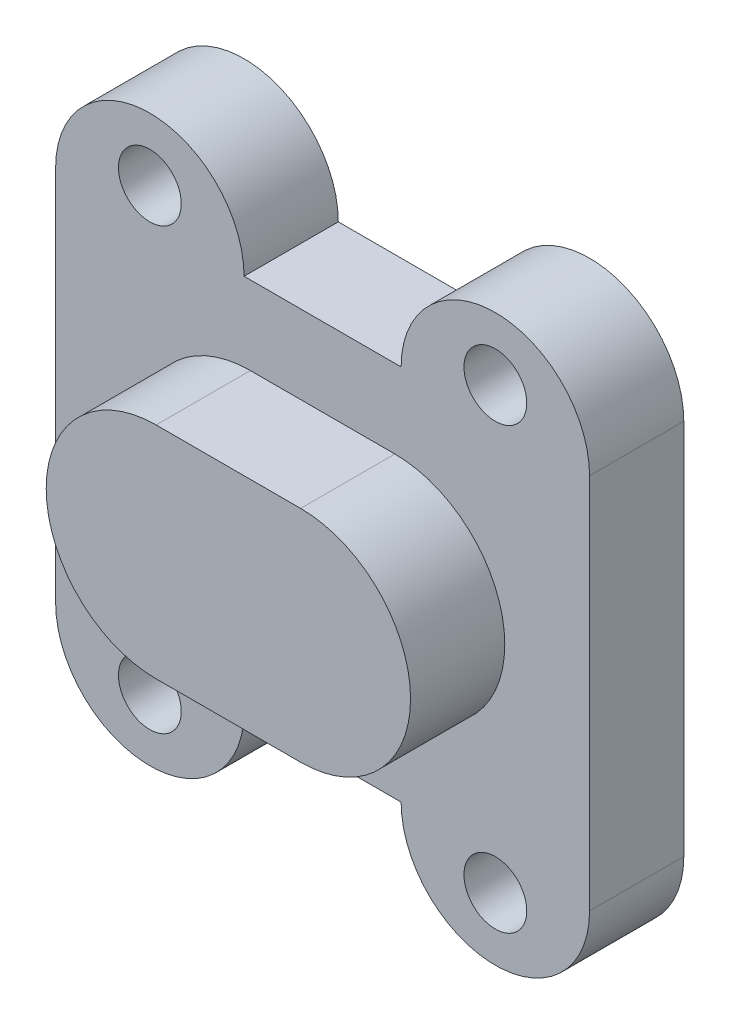
ISO-10303-21;
HEADER;
FILE_DESCRIPTION(('STEP AP214'),'2;1');
FILE_NAME('part.step','',(''),(''),'','','');
FILE_SCHEMA(('AUTOMOTIVE_DESIGN { 1 0 10303 214 1 1 1 1 }'));
ENDSEC;
DATA;
#1=APPLICATION_CONTEXT('core data for automotive mechanical design processes');
#2=APPLICATION_PROTOCOL_DEFINITION('international standard','automotive_design',2000,#1);
#3=PRODUCT_CONTEXT('',#1,'mechanical');
#4=PRODUCT('Part','Part','',(#3));
#5=PRODUCT_RELATED_PRODUCT_CATEGORY('part','',(#4));
#6=PRODUCT_DEFINITION_FORMATION('','',#4);
#7=PRODUCT_DEFINITION_CONTEXT('part definition',#1,'design');
#8=PRODUCT_DEFINITION('design','',#6,#7);
#9=PRODUCT_DEFINITION_SHAPE('','',#8);
#10=(LENGTH_UNIT() NAMED_UNIT(*) SI_UNIT(.MILLI.,.METRE.));
#11=(NAMED_UNIT(*) PLANE_ANGLE_UNIT() SI_UNIT($,.RADIAN.));
#12=(NAMED_UNIT(*) SI_UNIT($,.STERADIAN.) SOLID_ANGLE_UNIT());
#13=UNCERTAINTY_MEASURE_WITH_UNIT(LENGTH_MEASURE(1.E-05),#10,'distance_accuracy_value','');
#14=(GEOMETRIC_REPRESENTATION_CONTEXT(3) GLOBAL_UNCERTAINTY_ASSIGNED_CONTEXT((#13)) GLOBAL_UNIT_ASSIGNED_CONTEXT((#10,
#11,#12)) REPRESENTATION_CONTEXT('',''));
#15=CARTESIAN_POINT('',(0.,0.,0.));
#16=DIRECTION('',(0.,0.,1.));
#17=DIRECTION('',(1.,0.,0.));
#18=AXIS2_PLACEMENT_3D('',#15,#16,#17);
#19=CARTESIAN_POINT('',(11.,-1.,3.));
#20=DIRECTION('',(0.,0.,1.));
#21=DIRECTION('',(1.,0.,0.));
#22=AXIS2_PLACEMENT_3D('',#19,#20,#21);
#23=PLANE('',#22);
#24=CARTESIAN_POINT('',(3.2,-7.,3.));
#25=DIRECTION('',(0.,0.,1.));
#26=DIRECTION('',(1.,0.,0.));
#27=AXIS2_PLACEMENT_3D('',#24,#25,#26);
#28=CIRCLE('',#27,3.5);
#29=CARTESIAN_POINT('',(3.2,-3.5,3.));
#30=VERTEX_POINT('',#29);
#31=CARTESIAN_POINT('',(3.2,-10.5,3.));
#32=VERTEX_POINT('',#31);
#33=EDGE_CURVE('E60',#30,#32,#28,.T.);
#34=ORIENTED_EDGE('',*,*,#33,.F.);
#35=DIRECTION('',(-1.,0.,0.));
#36=VECTOR('',#35,1.);
#37=CARTESIAN_POINT('',(3.2,-3.5,3.));
#38=LINE('',#37,#36);
#39=CARTESIAN_POINT('',(7.8,-3.5,3.));
#40=VERTEX_POINT('',#39);
#41=EDGE_CURVE('E64',#40,#30,#38,.T.);
#42=ORIENTED_EDGE('',*,*,#41,.F.);
#43=CARTESIAN_POINT('',(7.8,-7.,3.));
#44=DIRECTION('',(0.,0.,1.));
#45=DIRECTION('',(1.,0.,0.));
#46=AXIS2_PLACEMENT_3D('',#43,#44,#45);
#47=CIRCLE('',#46,3.5);
#48=CARTESIAN_POINT('',(7.8,-10.5,3.));
#49=VERTEX_POINT('',#48);
#50=EDGE_CURVE('E489',#49,#40,#47,.T.);
#51=ORIENTED_EDGE('',*,*,#50,.F.);
#52=DIRECTION('',(1.,0.,0.));
#53=VECTOR('',#52,1.);
#54=CARTESIAN_POINT('',(3.2,-10.5,3.));
#55=LINE('',#54,#53);
#56=EDGE_CURVE('E499',#32,#49,#55,.T.);
#57=ORIENTED_EDGE('',*,*,#56,.F.);
#58=EDGE_LOOP('',(#34,#42,#51,#57));
#59=FACE_BOUND('',#58,.T.);
#60=CARTESIAN_POINT('',(11.,0.,3.));
#61=DIRECTION('',(0.,0.,1.));
#62=DIRECTION('',(1.,0.,0.));
#63=AXIS2_PLACEMENT_3D('',#60,#61,#62);
#64=CIRCLE('',#63,1.);
#65=CARTESIAN_POINT('',(12.,0.,3.));
#66=VERTEX_POINT('',#65);
#67=EDGE_CURVE('E172',#66,#66,#64,.T.);
#68=ORIENTED_EDGE('',*,*,#67,.F.);
#69=EDGE_LOOP('',(#68));
#70=FACE_BOUND('',#69,.T.);
#71=CARTESIAN_POINT('',(11.,-14.,3.));
#72=DIRECTION('',(0.,0.,1.));
#73=DIRECTION('',(1.,0.,0.));
#74=AXIS2_PLACEMENT_3D('',#71,#72,#73);
#75=CIRCLE('',#74,0.999999999999998);
#76=CARTESIAN_POINT('',(12.,-14.,3.));
#77=VERTEX_POINT('',#76);
#78=EDGE_CURVE('E188',#77,#77,#75,.T.);
#79=ORIENTED_EDGE('',*,*,#78,.F.);
#80=EDGE_LOOP('',(#79));
#81=FACE_BOUND('',#80,.T.);
#82=CARTESIAN_POINT('',(11.,-1.,3.));
#83=DIRECTION('',(0.,0.,1.));
#84=DIRECTION('',(1.,0.,0.));
#85=AXIS2_PLACEMENT_3D('',#82,#83,#84);
#86=CIRCLE('',#85,3.);
#87=CARTESIAN_POINT('',(14.,-1.,3.));
#88=VERTEX_POINT('',#87);
#89=CARTESIAN_POINT('',(8.,-1.,3.));
#90=VERTEX_POINT('',#89);
#91=EDGE_CURVE('E196',#88,#90,#86,.T.);
#92=ORIENTED_EDGE('',*,*,#91,.T.);
#93=DIRECTION('',(-1.,0.,0.));
#94=VECTOR('',#93,1.);
#95=CARTESIAN_POINT('',(3.,-1.,3.));
#96=LINE('',#95,#94);
#97=CARTESIAN_POINT('',(3.,-1.,3.));
#98=VERTEX_POINT('',#97);
#99=EDGE_CURVE('E200',#90,#98,#96,.T.);
#100=ORIENTED_EDGE('',*,*,#99,.T.);
#101=CARTESIAN_POINT('',(0.,-1.,3.));
#102=DIRECTION('',(0.,0.,1.));
#103=DIRECTION('',(1.,0.,0.));
#104=AXIS2_PLACEMENT_3D('',#101,#102,#103);
#105=CIRCLE('',#104,3.);
#106=CARTESIAN_POINT('',(-3.,-1.,3.));
#107=VERTEX_POINT('',#106);
#108=EDGE_CURVE('E204',#98,#107,#105,.T.);
#109=ORIENTED_EDGE('',*,*,#108,.T.);
#110=DIRECTION('',(0.,-1.,0.));
#111=VECTOR('',#110,1.);
#112=CARTESIAN_POINT('',(-3.,-1.,3.));
#113=LINE('',#112,#111);
#114=CARTESIAN_POINT('',(-3.,-13.,3.));
#115=VERTEX_POINT('',#114);
#116=EDGE_CURVE('E207',#107,#115,#113,.T.);
#117=ORIENTED_EDGE('',*,*,#116,.T.);
#118=CARTESIAN_POINT('',(0.,-13.,3.));
#119=DIRECTION('',(0.,0.,1.));
#120=DIRECTION('',(1.,0.,0.));
#121=AXIS2_PLACEMENT_3D('',#118,#119,#120);
#122=CIRCLE('',#121,3.);
#123=CARTESIAN_POINT('',(3.,-13.,3.));
#124=VERTEX_POINT('',#123);
#125=EDGE_CURVE('E210',#115,#124,#122,.T.);
#126=ORIENTED_EDGE('',*,*,#125,.T.);
#127=DIRECTION('',(1.,0.,0.));
#128=VECTOR('',#127,1.);
#129=CARTESIAN_POINT('',(3.,-13.,3.));
#130=LINE('',#129,#128);
#131=CARTESIAN_POINT('',(8.,-13.,3.));
#132=VERTEX_POINT('',#131);
#133=EDGE_CURVE('E213',#124,#132,#130,.T.);
#134=ORIENTED_EDGE('',*,*,#133,.T.);
#135=CARTESIAN_POINT('',(11.,-13.,3.));
#136=DIRECTION('',(0.,0.,1.));
#137=DIRECTION('',(1.,0.,0.));
#138=AXIS2_PLACEMENT_3D('',#135,#136,#137);
#139=CIRCLE('',#138,3.);
#140=CARTESIAN_POINT('',(14.,-13.,3.));
#141=VERTEX_POINT('',#140);
#142=EDGE_CURVE('E216',#132,#141,#139,.T.);
#143=ORIENTED_EDGE('',*,*,#142,.T.);
#144=DIRECTION('',(0.,1.,0.));
#145=VECTOR('',#144,1.);
#146=CARTESIAN_POINT('',(14.,-1.,3.));
#147=LINE('',#146,#145);
#148=EDGE_CURVE('E219',#141,#88,#147,.T.);
#149=ORIENTED_EDGE('',*,*,#148,.T.);
#150=EDGE_LOOP('',(#92,#100,#109,#117,#126,#134,#143,#149));
#151=FACE_BOUND('',#150,.T.);
#152=CARTESIAN_POINT('',(0.,0.,3.));
#153=DIRECTION('',(0.,0.,1.));
#154=DIRECTION('',(1.,0.,0.));
#155=AXIS2_PLACEMENT_3D('',#152,#153,#154);
#156=CIRCLE('',#155,1.);
#157=CARTESIAN_POINT('',(1.,0.,3.));
#158=VERTEX_POINT('',#157);
#159=EDGE_CURVE('E180',#158,#158,#156,.T.);
#160=ORIENTED_EDGE('',*,*,#159,.F.);
#161=EDGE_LOOP('',(#160));
#162=FACE_BOUND('',#161,.T.);
#163=CARTESIAN_POINT('',(0.,-14.,3.));
#164=DIRECTION('',(0.,0.,1.));
#165=DIRECTION('',(1.,0.,0.));
#166=AXIS2_PLACEMENT_3D('',#163,#164,#165);
#167=CIRCLE('',#166,1.);
#168=CARTESIAN_POINT('',(1.,-14.,3.));
#169=VERTEX_POINT('',#168);
#170=EDGE_CURVE('E162',#169,#169,#167,.T.);
#171=ORIENTED_EDGE('',*,*,#170,.F.);
#172=EDGE_LOOP('',(#171));
#173=FACE_BOUND('',#172,.T.);
#174=ADVANCED_FACE('F44',(#59,#70,#81,#151,#162,#173),#23,.T.);
#175=CARTESIAN_POINT('',(11.,-1.,0.));
#176=DIRECTION('',(0.,0.,1.));
#177=DIRECTION('',(1.,0.,0.));
#178=AXIS2_PLACEMENT_3D('',#175,#176,#177);
#179=PLANE('',#178);
#180=CARTESIAN_POINT('',(11.,-1.,0.));
#181=DIRECTION('',(0.,0.,1.));
#182=DIRECTION('',(1.,0.,0.));
#183=AXIS2_PLACEMENT_3D('',#180,#181,#182);
#184=CIRCLE('',#183,3.);
#185=CARTESIAN_POINT('',(14.,-1.,0.));
#186=VERTEX_POINT('',#185);
#187=CARTESIAN_POINT('',(8.,-1.,0.));
#188=VERTEX_POINT('',#187);
#189=EDGE_CURVE('E192',#186,#188,#184,.T.);
#190=ORIENTED_EDGE('',*,*,#189,.F.);
#191=DIRECTION('',(0.,1.,0.));
#192=VECTOR('',#191,1.);
#193=CARTESIAN_POINT('',(14.,-1.,0.));
#194=LINE('',#193,#192);
#195=CARTESIAN_POINT('',(14.,-13.,0.));
#196=VERTEX_POINT('',#195);
#197=EDGE_CURVE('E201',#196,#186,#194,.T.);
#198=ORIENTED_EDGE('',*,*,#197,.F.);
#199=CARTESIAN_POINT('',(11.,-13.,0.));
#200=DIRECTION('',(0.,0.,1.));
#201=DIRECTION('',(1.,0.,0.));
#202=AXIS2_PLACEMENT_3D('',#199,#200,#201);
#203=CIRCLE('',#202,3.);
#204=CARTESIAN_POINT('',(8.,-13.,0.));
#205=VERTEX_POINT('',#204);
#206=EDGE_CURVE('E241',#205,#196,#203,.T.);
#207=ORIENTED_EDGE('',*,*,#206,.F.);
#208=DIRECTION('',(1.,0.,0.));
#209=VECTOR('',#208,1.);
#210=CARTESIAN_POINT('',(3.,-13.,0.));
#211=LINE('',#210,#209);
#212=CARTESIAN_POINT('',(3.,-13.,0.));
#213=VERTEX_POINT('',#212);
#214=EDGE_CURVE('E238',#213,#205,#211,.T.);
#215=ORIENTED_EDGE('',*,*,#214,.F.);
#216=CARTESIAN_POINT('',(0.,-13.,0.));
#217=DIRECTION('',(0.,0.,1.));
#218=DIRECTION('',(1.,0.,0.));
#219=AXIS2_PLACEMENT_3D('',#216,#217,#218);
#220=CIRCLE('',#219,3.);
#221=CARTESIAN_POINT('',(-3.,-13.,0.));
#222=VERTEX_POINT('',#221);
#223=EDGE_CURVE('E235',#222,#213,#220,.T.);
#224=ORIENTED_EDGE('',*,*,#223,.F.);
#225=DIRECTION('',(0.,-1.,0.));
#226=VECTOR('',#225,1.);
#227=CARTESIAN_POINT('',(-3.,-1.,0.));
#228=LINE('',#227,#226);
#229=CARTESIAN_POINT('',(-3.,-1.,0.));
#230=VERTEX_POINT('',#229);
#231=EDGE_CURVE('E232',#230,#222,#228,.T.);
#232=ORIENTED_EDGE('',*,*,#231,.F.);
#233=CARTESIAN_POINT('',(0.,-1.,0.));
#234=DIRECTION('',(0.,0.,1.));
#235=DIRECTION('',(1.,0.,0.));
#236=AXIS2_PLACEMENT_3D('',#233,#234,#235);
#237=CIRCLE('',#236,3.);
#238=CARTESIAN_POINT('',(3.,-1.,0.));
#239=VERTEX_POINT('',#238);
#240=EDGE_CURVE('E229',#239,#230,#237,.T.);
#241=ORIENTED_EDGE('',*,*,#240,.F.);
#242=DIRECTION('',(-1.,0.,0.));
#243=VECTOR('',#242,1.);
#244=CARTESIAN_POINT('',(3.,-1.,0.));
#245=LINE('',#244,#243);
#246=EDGE_CURVE('E226',#188,#239,#245,.T.);
#247=ORIENTED_EDGE('',*,*,#246,.F.);
#248=EDGE_LOOP('',(#190,#198,#207,#215,#224,#232,#241,#247));
#249=FACE_BOUND('',#248,.T.);
#250=CARTESIAN_POINT('',(11.,-14.,0.));
#251=DIRECTION('',(0.,0.,1.));
#252=DIRECTION('',(1.,0.,0.));
#253=AXIS2_PLACEMENT_3D('',#250,#251,#252);
#254=CIRCLE('',#253,0.999999999999998);
#255=CARTESIAN_POINT('',(12.,-14.,0.));
#256=VERTEX_POINT('',#255);
#257=EDGE_CURVE('E184',#256,#256,#254,.T.);
#258=ORIENTED_EDGE('',*,*,#257,.T.);
#259=EDGE_LOOP('',(#258));
#260=FACE_BOUND('',#259,.T.);
#261=CARTESIAN_POINT('',(0.,0.,0.));
#262=DIRECTION('',(0.,0.,1.));
#263=DIRECTION('',(1.,0.,0.));
#264=AXIS2_PLACEMENT_3D('',#261,#262,#263);
#265=CIRCLE('',#264,1.);
#266=CARTESIAN_POINT('',(1.,0.,0.));
#267=VERTEX_POINT('',#266);
#268=EDGE_CURVE('E176',#267,#267,#265,.T.);
#269=ORIENTED_EDGE('',*,*,#268,.T.);
#270=EDGE_LOOP('',(#269));
#271=FACE_BOUND('',#270,.T.);
#272=CARTESIAN_POINT('',(11.,0.,0.));
#273=DIRECTION('',(0.,0.,1.));
#274=DIRECTION('',(1.,0.,0.));
#275=AXIS2_PLACEMENT_3D('',#272,#273,#274);
#276=CIRCLE('',#275,1.);
#277=CARTESIAN_POINT('',(12.,0.,0.));
#278=VERTEX_POINT('',#277);
#279=EDGE_CURVE('E170',#278,#278,#276,.T.);
#280=ORIENTED_EDGE('',*,*,#279,.T.);
#281=EDGE_LOOP('',(#280));
#282=FACE_BOUND('',#281,.T.);
#283=CARTESIAN_POINT('',(0.,-14.,0.));
#284=DIRECTION('',(0.,0.,1.));
#285=DIRECTION('',(1.,0.,0.));
#286=AXIS2_PLACEMENT_3D('',#283,#284,#285);
#287=CIRCLE('',#286,1.);
#288=CARTESIAN_POINT('',(1.,-14.,0.));
#289=VERTEX_POINT('',#288);
#290=EDGE_CURVE('E157',#289,#289,#287,.T.);
#291=ORIENTED_EDGE('',*,*,#290,.T.);
#292=EDGE_LOOP('',(#291));
#293=FACE_BOUND('',#292,.T.);
#294=ADVANCED_FACE('F280',(#249,#260,#271,#282,#293),#179,.F.);
#295=CARTESIAN_POINT('',(11.,-1.,3.));
#296=DIRECTION('',(0.,0.,-1.));
#297=DIRECTION('',(-1.,0.,0.));
#298=AXIS2_PLACEMENT_3D('',#295,#296,#297);
#299=CYLINDRICAL_SURFACE('',#298,3.);
#300=ORIENTED_EDGE('',*,*,#189,.T.);
#301=DIRECTION('',(0.,0.,-1.));
#302=VECTOR('',#301,1.);
#303=CARTESIAN_POINT('',(8.,-1.,3.));
#304=LINE('',#303,#302);
#305=EDGE_CURVE('E11',#90,#188,#304,.T.);
#306=ORIENTED_EDGE('',*,*,#305,.F.);
#307=ORIENTED_EDGE('',*,*,#91,.F.);
#308=DIRECTION('',(0.,0.,-1.));
#309=VECTOR('',#308,1.);
#310=CARTESIAN_POINT('',(14.,-1.,3.));
#311=LINE('',#310,#309);
#312=EDGE_CURVE('E222',#88,#186,#311,.T.);
#313=ORIENTED_EDGE('',*,*,#312,.T.);
#314=EDGE_LOOP('',(#300,#306,#307,#313));
#315=FACE_BOUND('',#314,.T.);
#316=ADVANCED_FACE('F46',(#315),#299,.T.);
#317=CARTESIAN_POINT('',(3.,-1.,3.));
#318=DIRECTION('',(0.,-1.,0.));
#319=DIRECTION('',(0.,0.,-1.));
#320=AXIS2_PLACEMENT_3D('',#317,#318,#319);
#321=PLANE('',#320);
#322=ORIENTED_EDGE('',*,*,#246,.T.);
#323=DIRECTION('',(0.,0.,-1.));
#324=VECTOR('',#323,1.);
#325=CARTESIAN_POINT('',(3.,-1.,3.));
#326=LINE('',#325,#324);
#327=EDGE_CURVE('E53',#98,#239,#326,.T.);
#328=ORIENTED_EDGE('',*,*,#327,.F.);
#329=ORIENTED_EDGE('',*,*,#99,.F.);
#330=ORIENTED_EDGE('',*,*,#305,.T.);
#331=EDGE_LOOP('',(#322,#328,#329,#330));
#332=FACE_BOUND('',#331,.T.);
#333=ADVANCED_FACE('F298',(#332),#321,.F.);
#334=CARTESIAN_POINT('',(0.,-1.,3.));
#335=DIRECTION('',(0.,0.,-1.));
#336=DIRECTION('',(-1.,0.,0.));
#337=AXIS2_PLACEMENT_3D('',#334,#335,#336);
#338=CYLINDRICAL_SURFACE('',#337,3.);
#339=ORIENTED_EDGE('',*,*,#240,.T.);
#340=DIRECTION('',(0.,0.,-1.));
#341=VECTOR('',#340,1.);
#342=CARTESIAN_POINT('',(-3.,-1.,3.));
#343=LINE('',#342,#341);
#344=EDGE_CURVE('E265',#107,#230,#343,.T.);
#345=ORIENTED_EDGE('',*,*,#344,.F.);
#346=ORIENTED_EDGE('',*,*,#108,.F.);
#347=ORIENTED_EDGE('',*,*,#327,.T.);
#348=EDGE_LOOP('',(#339,#345,#346,#347));
#349=FACE_BOUND('',#348,.T.);
#350=ADVANCED_FACE('F274',(#349),#338,.T.);
#351=CARTESIAN_POINT('',(-3.,-1.,3.));
#352=DIRECTION('',(1.,0.,0.));
#353=DIRECTION('',(0.,0.,-1.));
#354=AXIS2_PLACEMENT_3D('',#351,#352,#353);
#355=PLANE('',#354);
#356=ORIENTED_EDGE('',*,*,#231,.T.);
#357=DIRECTION('',(0.,0.,-1.));
#358=VECTOR('',#357,1.);
#359=CARTESIAN_POINT('',(-3.,-13.,3.));
#360=LINE('',#359,#358);
#361=EDGE_CURVE('E261',#115,#222,#360,.T.);
#362=ORIENTED_EDGE('',*,*,#361,.F.);
#363=ORIENTED_EDGE('',*,*,#116,.F.);
#364=ORIENTED_EDGE('',*,*,#344,.T.);
#365=EDGE_LOOP('',(#356,#362,#363,#364));
#366=FACE_BOUND('',#365,.T.);
#367=ADVANCED_FACE('F286',(#366),#355,.F.);
#368=CARTESIAN_POINT('',(0.,-13.,3.));
#369=DIRECTION('',(0.,0.,-1.));
#370=DIRECTION('',(-1.,0.,0.));
#371=AXIS2_PLACEMENT_3D('',#368,#369,#370);
#372=CYLINDRICAL_SURFACE('',#371,3.);
#373=ORIENTED_EDGE('',*,*,#223,.T.);
#374=DIRECTION('',(0.,0.,-1.));
#375=VECTOR('',#374,1.);
#376=CARTESIAN_POINT('',(3.,-13.,3.));
#377=LINE('',#376,#375);
#378=EDGE_CURVE('E257',#124,#213,#377,.T.);
#379=ORIENTED_EDGE('',*,*,#378,.F.);
#380=ORIENTED_EDGE('',*,*,#125,.F.);
#381=ORIENTED_EDGE('',*,*,#361,.T.);
#382=EDGE_LOOP('',(#373,#379,#380,#381));
#383=FACE_BOUND('',#382,.T.);
#384=ADVANCED_FACE('F290',(#383),#372,.T.);
#385=CARTESIAN_POINT('',(3.,-13.,3.));
#386=DIRECTION('',(0.,1.,0.));
#387=DIRECTION('',(0.,0.,1.));
#388=AXIS2_PLACEMENT_3D('',#385,#386,#387);
#389=PLANE('',#388);
#390=ORIENTED_EDGE('',*,*,#214,.T.);
#391=DIRECTION('',(0.,0.,-1.));
#392=VECTOR('',#391,1.);
#393=CARTESIAN_POINT('',(8.,-13.,3.));
#394=LINE('',#393,#392);
#395=EDGE_CURVE('E253',#132,#205,#394,.T.);
#396=ORIENTED_EDGE('',*,*,#395,.F.);
#397=ORIENTED_EDGE('',*,*,#133,.F.);
#398=ORIENTED_EDGE('',*,*,#378,.T.);
#399=EDGE_LOOP('',(#390,#396,#397,#398));
#400=FACE_BOUND('',#399,.T.);
#401=ADVANCED_FACE('F311',(#400),#389,.F.);
#402=CARTESIAN_POINT('',(11.,-13.,3.));
#403=DIRECTION('',(0.,0.,-1.));
#404=DIRECTION('',(-1.,0.,0.));
#405=AXIS2_PLACEMENT_3D('',#402,#403,#404);
#406=CYLINDRICAL_SURFACE('',#405,3.);
#407=ORIENTED_EDGE('',*,*,#206,.T.);
#408=DIRECTION('',(0.,0.,-1.));
#409=VECTOR('',#408,1.);
#410=CARTESIAN_POINT('',(14.,-13.,3.));
#411=LINE('',#410,#409);
#412=EDGE_CURVE('E249',#141,#196,#411,.T.);
#413=ORIENTED_EDGE('',*,*,#412,.F.);
#414=ORIENTED_EDGE('',*,*,#142,.F.);
#415=ORIENTED_EDGE('',*,*,#395,.T.);
#416=EDGE_LOOP('',(#407,#413,#414,#415));
#417=FACE_BOUND('',#416,.T.);
#418=ADVANCED_FACE('F309',(#417),#406,.T.);
#419=CARTESIAN_POINT('',(14.,-1.,3.));
#420=DIRECTION('',(-1.,0.,0.));
#421=DIRECTION('',(0.,-1.,0.));
#422=AXIS2_PLACEMENT_3D('',#419,#420,#421);
#423=PLANE('',#422);
#424=ORIENTED_EDGE('',*,*,#197,.T.);
#425=ORIENTED_EDGE('',*,*,#312,.F.);
#426=ORIENTED_EDGE('',*,*,#148,.F.);
#427=ORIENTED_EDGE('',*,*,#412,.T.);
#428=EDGE_LOOP('',(#424,#425,#426,#427));
#429=FACE_BOUND('',#428,.T.);
#430=ADVANCED_FACE('F304',(#429),#423,.F.);
#431=CARTESIAN_POINT('',(11.,-14.,3.));
#432=DIRECTION('',(0.,0.,-1.));
#433=DIRECTION('',(-1.,0.,0.));
#434=AXIS2_PLACEMENT_3D('',#431,#432,#433);
#435=CYLINDRICAL_SURFACE('',#434,0.999999999999998);
#436=ORIENTED_EDGE('',*,*,#78,.T.);
#437=EDGE_LOOP('',(#436));
#438=FACE_BOUND('',#437,.T.);
#439=ORIENTED_EDGE('',*,*,#257,.F.);
#440=EDGE_LOOP('',(#439));
#441=FACE_BOUND('',#440,.T.);
#442=ADVANCED_FACE('F330',(#438,#441),#435,.F.);
#443=CARTESIAN_POINT('',(0.,0.,3.));
#444=DIRECTION('',(0.,0.,-1.));
#445=DIRECTION('',(-1.,0.,0.));
#446=AXIS2_PLACEMENT_3D('',#443,#444,#445);
#447=CYLINDRICAL_SURFACE('',#446,1.);
#448=ORIENTED_EDGE('',*,*,#159,.T.);
#449=EDGE_LOOP('',(#448));
#450=FACE_BOUND('',#449,.T.);
#451=ORIENTED_EDGE('',*,*,#268,.F.);
#452=EDGE_LOOP('',(#451));
#453=FACE_BOUND('',#452,.T.);
#454=ADVANCED_FACE('F337',(#450,#453),#447,.F.);
#455=CARTESIAN_POINT('',(11.,0.,3.));
#456=DIRECTION('',(0.,0.,-1.));
#457=DIRECTION('',(-1.,0.,0.));
#458=AXIS2_PLACEMENT_3D('',#455,#456,#457);
#459=CYLINDRICAL_SURFACE('',#458,1.);
#460=ORIENTED_EDGE('',*,*,#67,.T.);
#461=EDGE_LOOP('',(#460));
#462=FACE_BOUND('',#461,.T.);
#463=ORIENTED_EDGE('',*,*,#279,.F.);
#464=EDGE_LOOP('',(#463));
#465=FACE_BOUND('',#464,.T.);
#466=ADVANCED_FACE('F342',(#462,#465),#459,.F.);
#467=CARTESIAN_POINT('',(0.,-14.,3.));
#468=DIRECTION('',(0.,0.,-1.));
#469=DIRECTION('',(-1.,0.,0.));
#470=AXIS2_PLACEMENT_3D('',#467,#468,#469);
#471=CYLINDRICAL_SURFACE('',#470,1.);
#472=ORIENTED_EDGE('',*,*,#170,.T.);
#473=EDGE_LOOP('',(#472));
#474=FACE_BOUND('',#473,.T.);
#475=ORIENTED_EDGE('',*,*,#290,.F.);
#476=EDGE_LOOP('',(#475));
#477=FACE_BOUND('',#476,.T.);
#478=ADVANCED_FACE('F354',(#474,#477),#471,.F.);
#479=CARTESIAN_POINT('',(3.2,-7.,6.));
#480=DIRECTION('',(0.,0.,-1.));
#481=DIRECTION('',(-1.,0.,0.));
#482=AXIS2_PLACEMENT_3D('',#479,#480,#481);
#483=CYLINDRICAL_SURFACE('',#482,3.5);
#484=ORIENTED_EDGE('',*,*,#33,.T.);
#485=DIRECTION('',(0.,0.,-1.));
#486=VECTOR('',#485,1.);
#487=CARTESIAN_POINT('',(3.2,-10.5,6.));
#488=LINE('',#487,#486);
#489=CARTESIAN_POINT('',(3.2,-10.5,6.));
#490=VERTEX_POINT('',#489);
#491=EDGE_CURVE('E137',#490,#32,#488,.T.);
#492=ORIENTED_EDGE('',*,*,#491,.F.);
#493=CARTESIAN_POINT('',(3.2,-7.,6.));
#494=DIRECTION('',(0.,0.,1.));
#495=DIRECTION('',(1.,0.,0.));
#496=AXIS2_PLACEMENT_3D('',#493,#494,#495);
#497=CIRCLE('',#496,3.5);
#498=CARTESIAN_POINT('',(3.2,-3.5,6.));
#499=VERTEX_POINT('',#498);
#500=EDGE_CURVE('E144',#499,#490,#497,.T.);
#501=ORIENTED_EDGE('',*,*,#500,.F.);
#502=DIRECTION('',(0.,0.,-1.));
#503=VECTOR('',#502,1.);
#504=CARTESIAN_POINT('',(3.2,-3.5,6.));
#505=LINE('',#504,#503);
#506=EDGE_CURVE('E486',#499,#30,#505,.T.);
#507=ORIENTED_EDGE('',*,*,#506,.T.);
#508=EDGE_LOOP('',(#484,#492,#501,#507));
#509=FACE_BOUND('',#508,.T.);
#510=ADVANCED_FACE('F155',(#509),#483,.T.);
#511=CARTESIAN_POINT('',(3.2,-10.5,6.));
#512=DIRECTION('',(0.,1.,0.));
#513=DIRECTION('',(0.,0.,1.));
#514=AXIS2_PLACEMENT_3D('',#511,#512,#513);
#515=PLANE('',#514);
#516=ORIENTED_EDGE('',*,*,#56,.T.);
#517=DIRECTION('',(0.,0.,-1.));
#518=VECTOR('',#517,1.);
#519=CARTESIAN_POINT('',(7.8,-10.5,6.));
#520=LINE('',#519,#518);
#521=CARTESIAN_POINT('',(7.8,-10.5,6.));
#522=VERTEX_POINT('',#521);
#523=EDGE_CURVE('E139',#522,#49,#520,.T.);
#524=ORIENTED_EDGE('',*,*,#523,.F.);
#525=DIRECTION('',(1.,0.,0.));
#526=VECTOR('',#525,1.);
#527=CARTESIAN_POINT('',(3.2,-10.5,6.));
#528=LINE('',#527,#526);
#529=EDGE_CURVE('E132',#490,#522,#528,.T.);
#530=ORIENTED_EDGE('',*,*,#529,.F.);
#531=ORIENTED_EDGE('',*,*,#491,.T.);
#532=EDGE_LOOP('',(#516,#524,#530,#531));
#533=FACE_BOUND('',#532,.T.);
#534=ADVANCED_FACE('F135',(#533),#515,.F.);
#535=CARTESIAN_POINT('',(7.8,-7.,6.));
#536=DIRECTION('',(0.,0.,-1.));
#537=DIRECTION('',(-1.,0.,0.));
#538=AXIS2_PLACEMENT_3D('',#535,#536,#537);
#539=CYLINDRICAL_SURFACE('',#538,3.5);
#540=ORIENTED_EDGE('',*,*,#50,.T.);
#541=DIRECTION('',(0.,0.,-1.));
#542=VECTOR('',#541,1.);
#543=CARTESIAN_POINT('',(7.8,-3.5,6.));
#544=LINE('',#543,#542);
#545=CARTESIAN_POINT('',(7.8,-3.5,6.));
#546=VERTEX_POINT('',#545);
#547=EDGE_CURVE('E164',#546,#40,#544,.T.);
#548=ORIENTED_EDGE('',*,*,#547,.F.);
#549=CARTESIAN_POINT('',(7.8,-7.,6.));
#550=DIRECTION('',(0.,0.,1.));
#551=DIRECTION('',(1.,0.,0.));
#552=AXIS2_PLACEMENT_3D('',#549,#550,#551);
#553=CIRCLE('',#552,3.5);
#554=EDGE_CURVE('E143',#522,#546,#553,.T.);
#555=ORIENTED_EDGE('',*,*,#554,.F.);
#556=ORIENTED_EDGE('',*,*,#523,.T.);
#557=EDGE_LOOP('',(#540,#548,#555,#556));
#558=FACE_BOUND('',#557,.T.);
#559=ADVANCED_FACE('F366',(#558),#539,.T.);
#560=CARTESIAN_POINT('',(3.2,-3.5,6.));
#561=DIRECTION('',(0.,-1.,0.));
#562=DIRECTION('',(1.,0.,0.));
#563=AXIS2_PLACEMENT_3D('',#560,#561,#562);
#564=PLANE('',#563);
#565=ORIENTED_EDGE('',*,*,#41,.T.);
#566=ORIENTED_EDGE('',*,*,#506,.F.);
#567=DIRECTION('',(-1.,0.,0.));
#568=VECTOR('',#567,1.);
#569=CARTESIAN_POINT('',(3.2,-3.5,6.));
#570=LINE('',#569,#568);
#571=EDGE_CURVE('E149',#546,#499,#570,.T.);
#572=ORIENTED_EDGE('',*,*,#571,.F.);
#573=ORIENTED_EDGE('',*,*,#547,.T.);
#574=EDGE_LOOP('',(#565,#566,#572,#573));
#575=FACE_BOUND('',#574,.T.);
#576=ADVANCED_FACE('F369',(#575),#564,.F.);
#577=CARTESIAN_POINT('',(3.2,-7.,6.));
#578=DIRECTION('',(0.,0.,1.));
#579=DIRECTION('',(1.,0.,0.));
#580=AXIS2_PLACEMENT_3D('',#577,#578,#579);
#581=PLANE('',#580);
#582=ORIENTED_EDGE('',*,*,#500,.T.);
#583=ORIENTED_EDGE('',*,*,#529,.T.);
#584=ORIENTED_EDGE('',*,*,#554,.T.);
#585=ORIENTED_EDGE('',*,*,#571,.T.);
#586=EDGE_LOOP('',(#582,#583,#584,#585));
#587=FACE_BOUND('',#586,.T.);
#588=ADVANCED_FACE('F147',(#587),#581,.T.);
#589=CLOSED_SHELL('',(#174,#294,#316,#333,#350,#367,#384,#401,#418,#430,#442,#454,#466,#478,
#510,#534,#559,#576,#588));
#590=MANIFOLD_SOLID_BREP('B2',#589);
#591=ADVANCED_BREP_SHAPE_REPRESENTATION('',(#18,#590),#14);
#592=SHAPE_DEFINITION_REPRESENTATION(#9,#591);
ENDSEC;
END-ISO-10303-21;
